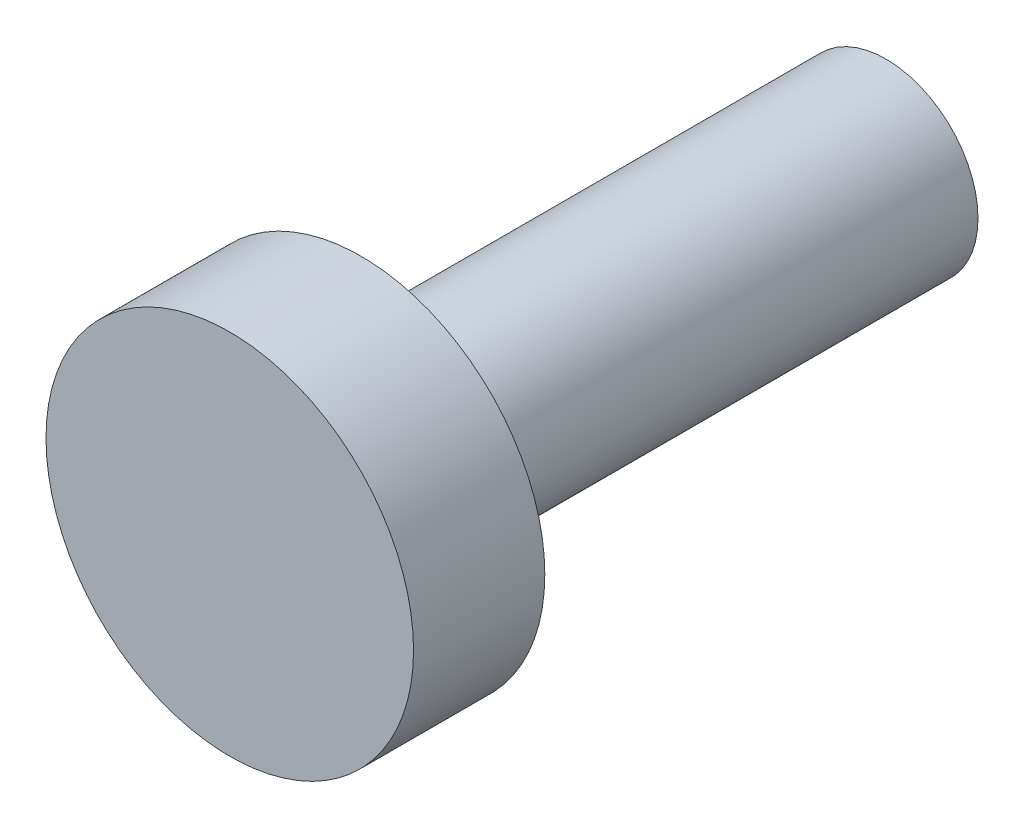
ISO-10303-21;
HEADER;
FILE_DESCRIPTION(('STEP AP214'),'2;1');
FILE_NAME('part.step','',(''),(''),'','','');
FILE_SCHEMA(('AUTOMOTIVE_DESIGN { 1 0 10303 214 1 1 1 1 }'));
ENDSEC;
DATA;
#1=APPLICATION_CONTEXT('core data for automotive mechanical design processes');
#2=APPLICATION_PROTOCOL_DEFINITION('international standard','automotive_design',2000,#1);
#3=PRODUCT_CONTEXT('',#1,'mechanical');
#4=PRODUCT('Part','Part','',(#3));
#5=PRODUCT_RELATED_PRODUCT_CATEGORY('part','',(#4));
#6=PRODUCT_DEFINITION_FORMATION('','',#4);
#7=PRODUCT_DEFINITION_CONTEXT('part definition',#1,'design');
#8=PRODUCT_DEFINITION('design','',#6,#7);
#9=PRODUCT_DEFINITION_SHAPE('','',#8);
#10=(LENGTH_UNIT() NAMED_UNIT(*) SI_UNIT(.MILLI.,.METRE.));
#11=(NAMED_UNIT(*) PLANE_ANGLE_UNIT() SI_UNIT($,.RADIAN.));
#12=(NAMED_UNIT(*) SI_UNIT($,.STERADIAN.) SOLID_ANGLE_UNIT());
#13=UNCERTAINTY_MEASURE_WITH_UNIT(LENGTH_MEASURE(1.E-05),#10,'distance_accuracy_value','');
#14=(GEOMETRIC_REPRESENTATION_CONTEXT(3) GLOBAL_UNCERTAINTY_ASSIGNED_CONTEXT((#13)) GLOBAL_UNIT_ASSIGNED_CONTEXT((#10,
#11,#12)) REPRESENTATION_CONTEXT('',''));
#15=CARTESIAN_POINT('',(0.,0.,0.));
#16=DIRECTION('',(0.,0.,1.));
#17=DIRECTION('',(1.,0.,0.));
#18=AXIS2_PLACEMENT_3D('',#15,#16,#17);
#19=CARTESIAN_POINT('',(0.,0.,10.));
#20=DIRECTION('',(0.,0.,-1.));
#21=DIRECTION('',(-1.,0.,0.));
#22=AXIS2_PLACEMENT_3D('',#19,#20,#21);
#23=CYLINDRICAL_SURFACE('',#22,1.75);
#24=CARTESIAN_POINT('',(0.,0.,10.));
#25=DIRECTION('',(0.,0.,1.));
#26=DIRECTION('',(1.,0.,0.));
#27=AXIS2_PLACEMENT_3D('',#24,#25,#26);
#28=CIRCLE('',#27,1.75);
#29=CARTESIAN_POINT('',(1.75,0.,10.));
#30=VERTEX_POINT('',#29);
#31=EDGE_CURVE('E10',#30,#30,#28,.T.);
#32=ORIENTED_EDGE('',*,*,#31,.F.);
#33=EDGE_LOOP('',(#32));
#34=FACE_BOUND('',#33,.T.);
#35=CARTESIAN_POINT('',(0.,0.,0.));
#36=DIRECTION('',(0.,0.,1.));
#37=DIRECTION('',(1.,0.,0.));
#38=AXIS2_PLACEMENT_3D('',#35,#36,#37);
#39=CIRCLE('',#38,1.75);
#40=CARTESIAN_POINT('',(1.75,0.,0.));
#41=VERTEX_POINT('',#40);
#42=EDGE_CURVE('E40',#41,#41,#39,.T.);
#43=ORIENTED_EDGE('',*,*,#42,.T.);
#44=EDGE_LOOP('',(#43));
#45=FACE_BOUND('',#44,.T.);
#46=ADVANCED_FACE('F37',(#34,#45),#23,.T.);
#47=CARTESIAN_POINT('',(0.,0.,0.));
#48=DIRECTION('',(0.,0.,1.));
#49=DIRECTION('',(1.,0.,0.));
#50=AXIS2_PLACEMENT_3D('',#47,#48,#49);
#51=PLANE('',#50);
#52=ORIENTED_EDGE('',*,*,#42,.F.);
#53=EDGE_LOOP('',(#52));
#54=FACE_BOUND('',#53,.T.);
#55=ADVANCED_FACE('F64',(#54),#51,.F.);
#56=CARTESIAN_POINT('',(0.,0.,12.5));
#57=DIRECTION('',(0.,0.,-1.));
#58=DIRECTION('',(-1.,0.,0.));
#59=AXIS2_PLACEMENT_3D('',#56,#57,#58);
#60=CYLINDRICAL_SURFACE('',#59,3.5);
#61=CARTESIAN_POINT('',(0.,0.,12.5));
#62=DIRECTION('',(0.,0.,1.));
#63=DIRECTION('',(1.,0.,0.));
#64=AXIS2_PLACEMENT_3D('',#61,#62,#63);
#65=CIRCLE('',#64,3.5);
#66=CARTESIAN_POINT('',(3.5,0.,12.5));
#67=VERTEX_POINT('',#66);
#68=EDGE_CURVE('E49',#67,#67,#65,.T.);
#69=ORIENTED_EDGE('',*,*,#68,.F.);
#70=EDGE_LOOP('',(#69));
#71=FACE_BOUND('',#70,.T.);
#72=CARTESIAN_POINT('',(0.,0.,10.));
#73=DIRECTION('',(0.,0.,1.));
#74=DIRECTION('',(1.,0.,0.));
#75=AXIS2_PLACEMENT_3D('',#72,#73,#74);
#76=CIRCLE('',#75,3.5);
#77=CARTESIAN_POINT('',(3.5,0.,10.));
#78=VERTEX_POINT('',#77);
#79=EDGE_CURVE('E51',#78,#78,#76,.T.);
#80=ORIENTED_EDGE('',*,*,#79,.T.);
#81=EDGE_LOOP('',(#80));
#82=FACE_BOUND('',#81,.T.);
#83=ADVANCED_FACE('F61',(#71,#82),#60,.T.);
#84=CARTESIAN_POINT('',(0.,0.,12.5));
#85=DIRECTION('',(0.,0.,1.));
#86=DIRECTION('',(1.,0.,0.));
#87=AXIS2_PLACEMENT_3D('',#84,#85,#86);
#88=PLANE('',#87);
#89=ORIENTED_EDGE('',*,*,#68,.T.);
#90=EDGE_LOOP('',(#89));
#91=FACE_BOUND('',#90,.T.);
#92=ADVANCED_FACE('F59',(#91),#88,.T.);
#93=CARTESIAN_POINT('',(0.,0.,10.));
#94=DIRECTION('',(0.,0.,1.));
#95=DIRECTION('',(1.,0.,0.));
#96=AXIS2_PLACEMENT_3D('',#93,#94,#95);
#97=PLANE('',#96);
#98=ORIENTED_EDGE('',*,*,#31,.T.);
#99=EDGE_LOOP('',(#98));
#100=FACE_BOUND('',#99,.T.);
#101=ORIENTED_EDGE('',*,*,#79,.F.);
#102=EDGE_LOOP('',(#101));
#103=FACE_BOUND('',#102,.T.);
#104=ADVANCED_FACE('F68',(#100,#103),#97,.F.);
#105=CLOSED_SHELL('',(#46,#55,#83,#92,#104));
#106=MANIFOLD_SOLID_BREP('B2',#105);
#107=ADVANCED_BREP_SHAPE_REPRESENTATION('',(#18,#106),#14);
#108=SHAPE_DEFINITION_REPRESENTATION(#9,#107);
ENDSEC;
END-ISO-10303-21;
